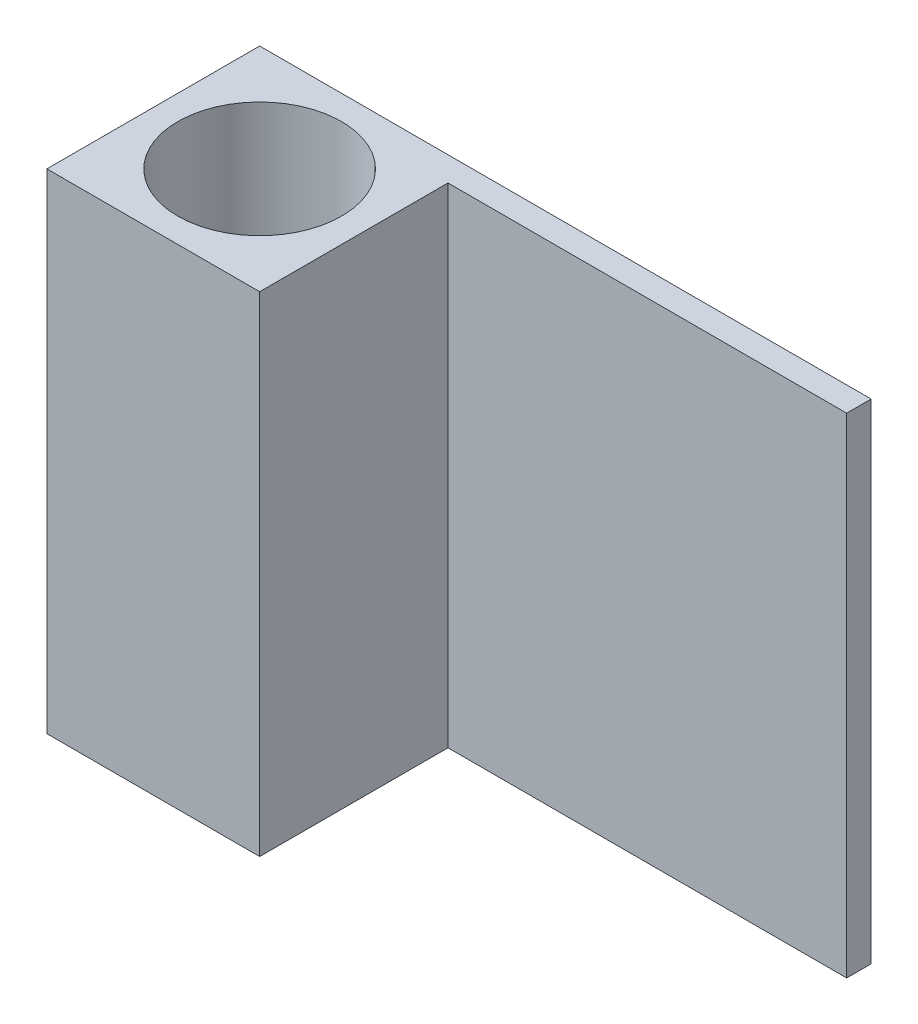
ISO-10303-21;
HEADER;
FILE_DESCRIPTION(('STEP AP214'),'2;1');
FILE_NAME('part.step','',(''),(''),'','','');
FILE_SCHEMA(('AUTOMOTIVE_DESIGN { 1 0 10303 214 1 1 1 1 }'));
ENDSEC;
DATA;
#1=APPLICATION_CONTEXT('core data for automotive mechanical design processes');
#2=APPLICATION_PROTOCOL_DEFINITION('international standard','automotive_design',2000,#1);
#3=PRODUCT_CONTEXT('',#1,'mechanical');
#4=PRODUCT('Part','Part','',(#3));
#5=PRODUCT_RELATED_PRODUCT_CATEGORY('part','',(#4));
#6=PRODUCT_DEFINITION_FORMATION('','',#4);
#7=PRODUCT_DEFINITION_CONTEXT('part definition',#1,'design');
#8=PRODUCT_DEFINITION('design','',#6,#7);
#9=PRODUCT_DEFINITION_SHAPE('','',#8);
#10=(LENGTH_UNIT() NAMED_UNIT(*) SI_UNIT(.MILLI.,.METRE.));
#11=(NAMED_UNIT(*) PLANE_ANGLE_UNIT() SI_UNIT($,.RADIAN.));
#12=(NAMED_UNIT(*) SI_UNIT($,.STERADIAN.) SOLID_ANGLE_UNIT());
#13=UNCERTAINTY_MEASURE_WITH_UNIT(LENGTH_MEASURE(1.E-05),#10,'distance_accuracy_value','');
#14=(GEOMETRIC_REPRESENTATION_CONTEXT(3) GLOBAL_UNCERTAINTY_ASSIGNED_CONTEXT((#13)) GLOBAL_UNIT_ASSIGNED_CONTEXT((#10,
#11,#12)) REPRESENTATION_CONTEXT('',''));
#15=CARTESIAN_POINT('',(0.,0.,0.));
#16=DIRECTION('',(0.,0.,1.));
#17=DIRECTION('',(1.,0.,0.));
#18=AXIS2_PLACEMENT_3D('',#15,#16,#17);
#19=CARTESIAN_POINT('',(82.6,80.,0.));
#20=DIRECTION('',(1.,0.,0.));
#21=DIRECTION('',(0.,0.,-1.));
#22=AXIS2_PLACEMENT_3D('',#19,#20,#21);
#23=PLANE('',#22);
#24=DIRECTION('',(0.,0.,1.));
#25=VECTOR('',#24,1.);
#26=CARTESIAN_POINT('',(82.6,0.,0.));
#27=LINE('',#26,#25);
#28=CARTESIAN_POINT('',(82.6,0.,-17.4));
#29=VERTEX_POINT('',#28);
#30=CARTESIAN_POINT('',(82.6,0.,-13.4));
#31=VERTEX_POINT('',#30);
#32=EDGE_CURVE('E120',#29,#31,#27,.T.);
#33=ORIENTED_EDGE('',*,*,#32,.F.);
#34=DIRECTION('',(0.,-1.,0.));
#35=VECTOR('',#34,1.);
#36=CARTESIAN_POINT('',(82.6,80.,-17.4));
#37=LINE('',#36,#35);
#38=CARTESIAN_POINT('',(82.6,80.,-17.4));
#39=VERTEX_POINT('',#38);
#40=EDGE_CURVE('E11',#39,#29,#37,.T.);
#41=ORIENTED_EDGE('',*,*,#40,.F.);
#42=DIRECTION('',(0.,0.,1.));
#43=VECTOR('',#42,1.);
#44=CARTESIAN_POINT('',(82.6,80.,0.));
#45=LINE('',#44,#43);
#46=CARTESIAN_POINT('',(82.6,80.,-13.4));
#47=VERTEX_POINT('',#46);
#48=EDGE_CURVE('E148',#39,#47,#45,.T.);
#49=ORIENTED_EDGE('',*,*,#48,.T.);
#50=DIRECTION('',(0.,-1.,0.));
#51=VECTOR('',#50,1.);
#52=CARTESIAN_POINT('',(82.6,80.,-13.4));
#53=LINE('',#52,#51);
#54=EDGE_CURVE('E80',#47,#31,#53,.T.);
#55=ORIENTED_EDGE('',*,*,#54,.T.);
#56=EDGE_LOOP('',(#33,#41,#49,#55));
#57=FACE_BOUND('',#56,.T.);
#58=ADVANCED_FACE('F35',(#57),#23,.T.);
#59=CARTESIAN_POINT('',(0.,80.,-17.4));
#60=DIRECTION('',(0.,0.,-1.));
#61=DIRECTION('',(-1.,0.,0.));
#62=AXIS2_PLACEMENT_3D('',#59,#60,#61);
#63=PLANE('',#62);
#64=DIRECTION('',(1.,0.,0.));
#65=VECTOR('',#64,1.);
#66=CARTESIAN_POINT('',(0.,0.,-17.4));
#67=LINE('',#66,#65);
#68=CARTESIAN_POINT('',(-17.4,0.,-17.4));
#69=VERTEX_POINT('',#68);
#70=EDGE_CURVE('E123',#69,#29,#67,.T.);
#71=ORIENTED_EDGE('',*,*,#70,.F.);
#72=DIRECTION('',(0.,-1.,0.));
#73=VECTOR('',#72,1.);
#74=CARTESIAN_POINT('',(-17.4,80.,-17.4));
#75=LINE('',#74,#73);
#76=CARTESIAN_POINT('',(-17.4,80.,-17.4));
#77=VERTEX_POINT('',#76);
#78=EDGE_CURVE('E44',#77,#69,#75,.T.);
#79=ORIENTED_EDGE('',*,*,#78,.F.);
#80=DIRECTION('',(1.,0.,0.));
#81=VECTOR('',#80,1.);
#82=CARTESIAN_POINT('',(0.,80.,-17.4));
#83=LINE('',#82,#81);
#84=EDGE_CURVE('E146',#77,#39,#83,.T.);
#85=ORIENTED_EDGE('',*,*,#84,.T.);
#86=ORIENTED_EDGE('',*,*,#40,.T.);
#87=EDGE_LOOP('',(#71,#79,#85,#86));
#88=FACE_BOUND('',#87,.T.);
#89=ADVANCED_FACE('F145',(#88),#63,.T.);
#90=CARTESIAN_POINT('',(-17.4,80.,0.));
#91=DIRECTION('',(1.,0.,0.));
#92=DIRECTION('',(0.,0.,-1.));
#93=AXIS2_PLACEMENT_3D('',#90,#91,#92);
#94=PLANE('',#93);
#95=DIRECTION('',(0.,0.,1.));
#96=VECTOR('',#95,1.);
#97=CARTESIAN_POINT('',(-17.4,0.,0.));
#98=LINE('',#97,#96);
#99=CARTESIAN_POINT('',(-17.4,0.,17.4));
#100=VERTEX_POINT('',#99);
#101=EDGE_CURVE('E126',#69,#100,#98,.T.);
#102=ORIENTED_EDGE('',*,*,#101,.T.);
#103=DIRECTION('',(0.,-1.,0.));
#104=VECTOR('',#103,1.);
#105=CARTESIAN_POINT('',(-17.4,80.,17.4));
#106=LINE('',#105,#104);
#107=CARTESIAN_POINT('',(-17.4,80.,17.4));
#108=VERTEX_POINT('',#107);
#109=EDGE_CURVE('E110',#108,#100,#106,.T.);
#110=ORIENTED_EDGE('',*,*,#109,.F.);
#111=DIRECTION('',(0.,0.,1.));
#112=VECTOR('',#111,1.);
#113=CARTESIAN_POINT('',(-17.4,80.,0.));
#114=LINE('',#113,#112);
#115=EDGE_CURVE('E98',#77,#108,#114,.T.);
#116=ORIENTED_EDGE('',*,*,#115,.F.);
#117=ORIENTED_EDGE('',*,*,#78,.T.);
#118=EDGE_LOOP('',(#102,#110,#116,#117));
#119=FACE_BOUND('',#118,.T.);
#120=ADVANCED_FACE('F139',(#119),#94,.F.);
#121=CARTESIAN_POINT('',(0.,80.,17.4));
#122=DIRECTION('',(0.,0.,-1.));
#123=DIRECTION('',(-1.,0.,0.));
#124=AXIS2_PLACEMENT_3D('',#121,#122,#123);
#125=PLANE('',#124);
#126=DIRECTION('',(1.,0.,0.));
#127=VECTOR('',#126,1.);
#128=CARTESIAN_POINT('',(0.,0.,17.4));
#129=LINE('',#128,#127);
#130=CARTESIAN_POINT('',(17.4,0.,17.4));
#131=VERTEX_POINT('',#130);
#132=EDGE_CURVE('E106',#100,#131,#129,.T.);
#133=ORIENTED_EDGE('',*,*,#132,.T.);
#134=DIRECTION('',(0.,-1.,0.));
#135=VECTOR('',#134,1.);
#136=CARTESIAN_POINT('',(17.4,80.,17.4));
#137=LINE('',#136,#135);
#138=CARTESIAN_POINT('',(17.4,80.,17.4));
#139=VERTEX_POINT('',#138);
#140=EDGE_CURVE('E104',#139,#131,#137,.T.);
#141=ORIENTED_EDGE('',*,*,#140,.F.);
#142=DIRECTION('',(1.,0.,0.));
#143=VECTOR('',#142,1.);
#144=CARTESIAN_POINT('',(0.,80.,17.4));
#145=LINE('',#144,#143);
#146=EDGE_CURVE('E91',#108,#139,#145,.T.);
#147=ORIENTED_EDGE('',*,*,#146,.F.);
#148=ORIENTED_EDGE('',*,*,#109,.T.);
#149=EDGE_LOOP('',(#133,#141,#147,#148));
#150=FACE_BOUND('',#149,.T.);
#151=ADVANCED_FACE('F105',(#150),#125,.F.);
#152=CARTESIAN_POINT('',(17.4,80.,0.));
#153=DIRECTION('',(1.,0.,0.));
#154=DIRECTION('',(0.,0.,-1.));
#155=AXIS2_PLACEMENT_3D('',#152,#153,#154);
#156=PLANE('',#155);
#157=DIRECTION('',(0.,0.,1.));
#158=VECTOR('',#157,1.);
#159=CARTESIAN_POINT('',(17.4,0.,0.));
#160=LINE('',#159,#158);
#161=CARTESIAN_POINT('',(17.4,0.,-13.4));
#162=VERTEX_POINT('',#161);
#163=EDGE_CURVE('E130',#162,#131,#160,.T.);
#164=ORIENTED_EDGE('',*,*,#163,.F.);
#165=DIRECTION('',(0.,-1.,0.));
#166=VECTOR('',#165,1.);
#167=CARTESIAN_POINT('',(17.4,80.,-13.4));
#168=LINE('',#167,#166);
#169=CARTESIAN_POINT('',(17.4,80.,-13.4));
#170=VERTEX_POINT('',#169);
#171=EDGE_CURVE('E73',#170,#162,#168,.T.);
#172=ORIENTED_EDGE('',*,*,#171,.F.);
#173=DIRECTION('',(0.,0.,1.));
#174=VECTOR('',#173,1.);
#175=CARTESIAN_POINT('',(17.4,80.,0.));
#176=LINE('',#175,#174);
#177=EDGE_CURVE('E95',#170,#139,#176,.T.);
#178=ORIENTED_EDGE('',*,*,#177,.T.);
#179=ORIENTED_EDGE('',*,*,#140,.T.);
#180=EDGE_LOOP('',(#164,#172,#178,#179));
#181=FACE_BOUND('',#180,.T.);
#182=ADVANCED_FACE('F112',(#181),#156,.T.);
#183=CARTESIAN_POINT('',(0.,80.,0.));
#184=DIRECTION('',(0.,-1.,0.));
#185=DIRECTION('',(0.,0.,-1.));
#186=AXIS2_PLACEMENT_3D('',#183,#184,#185);
#187=CYLINDRICAL_SURFACE('',#186,13.4);
#188=CARTESIAN_POINT('',(0.,80.,0.));
#189=DIRECTION('',(0.,1.,0.));
#190=DIRECTION('',(0.,0.,1.));
#191=AXIS2_PLACEMENT_3D('',#188,#189,#190);
#192=CIRCLE('',#191,13.4);
#193=CARTESIAN_POINT('',(0.,80.,13.4));
#194=VERTEX_POINT('',#193);
#195=EDGE_CURVE('E134',#194,#194,#192,.T.);
#196=ORIENTED_EDGE('',*,*,#195,.T.);
#197=EDGE_LOOP('',(#196));
#198=FACE_BOUND('',#197,.T.);
#199=CARTESIAN_POINT('',(0.,0.,0.));
#200=DIRECTION('',(0.,1.,0.));
#201=DIRECTION('',(0.,0.,1.));
#202=AXIS2_PLACEMENT_3D('',#199,#200,#201);
#203=CIRCLE('',#202,13.4);
#204=CARTESIAN_POINT('',(0.,0.,13.4));
#205=VERTEX_POINT('',#204);
#206=EDGE_CURVE('E117',#205,#205,#203,.T.);
#207=ORIENTED_EDGE('',*,*,#206,.F.);
#208=EDGE_LOOP('',(#207));
#209=FACE_BOUND('',#208,.T.);
#210=ADVANCED_FACE('F37',(#198,#209),#187,.F.);
#211=CARTESIAN_POINT('',(0.,80.,-13.4));
#212=DIRECTION('',(0.,0.,-1.));
#213=DIRECTION('',(-1.,0.,0.));
#214=AXIS2_PLACEMENT_3D('',#211,#212,#213);
#215=PLANE('',#214);
#216=DIRECTION('',(1.,0.,0.));
#217=VECTOR('',#216,1.);
#218=CARTESIAN_POINT('',(0.,0.,-13.4));
#219=LINE('',#218,#217);
#220=EDGE_CURVE('E132',#162,#31,#219,.T.);
#221=ORIENTED_EDGE('',*,*,#220,.T.);
#222=ORIENTED_EDGE('',*,*,#54,.F.);
#223=DIRECTION('',(1.,0.,0.));
#224=VECTOR('',#223,1.);
#225=CARTESIAN_POINT('',(0.,80.,-13.4));
#226=LINE('',#225,#224);
#227=EDGE_CURVE('E52',#170,#47,#226,.T.);
#228=ORIENTED_EDGE('',*,*,#227,.F.);
#229=ORIENTED_EDGE('',*,*,#171,.T.);
#230=EDGE_LOOP('',(#221,#222,#228,#229));
#231=FACE_BOUND('',#230,.T.);
#232=ADVANCED_FACE('F147',(#231),#215,.F.);
#233=CARTESIAN_POINT('',(0.,80.,0.));
#234=DIRECTION('',(0.,1.,0.));
#235=DIRECTION('',(0.,0.,1.));
#236=AXIS2_PLACEMENT_3D('',#233,#234,#235);
#237=PLANE('',#236);
#238=ORIENTED_EDGE('',*,*,#195,.F.);
#239=EDGE_LOOP('',(#238));
#240=FACE_BOUND('',#239,.T.);
#241=ORIENTED_EDGE('',*,*,#48,.F.);
#242=ORIENTED_EDGE('',*,*,#84,.F.);
#243=ORIENTED_EDGE('',*,*,#115,.T.);
#244=ORIENTED_EDGE('',*,*,#146,.T.);
#245=ORIENTED_EDGE('',*,*,#177,.F.);
#246=ORIENTED_EDGE('',*,*,#227,.T.);
#247=EDGE_LOOP('',(#241,#242,#243,#244,#245,#246));
#248=FACE_BOUND('',#247,.T.);
#249=ADVANCED_FACE('F93',(#240,#248),#237,.T.);
#250=CARTESIAN_POINT('',(0.,0.,0.));
#251=DIRECTION('',(0.,1.,0.));
#252=DIRECTION('',(0.,0.,1.));
#253=AXIS2_PLACEMENT_3D('',#250,#251,#252);
#254=PLANE('',#253);
#255=ORIENTED_EDGE('',*,*,#206,.T.);
#256=EDGE_LOOP('',(#255));
#257=FACE_BOUND('',#256,.T.);
#258=ORIENTED_EDGE('',*,*,#32,.T.);
#259=ORIENTED_EDGE('',*,*,#220,.F.);
#260=ORIENTED_EDGE('',*,*,#163,.T.);
#261=ORIENTED_EDGE('',*,*,#132,.F.);
#262=ORIENTED_EDGE('',*,*,#101,.F.);
#263=ORIENTED_EDGE('',*,*,#70,.T.);
#264=EDGE_LOOP('',(#258,#259,#260,#261,#262,#263));
#265=FACE_BOUND('',#264,.T.);
#266=ADVANCED_FACE('F144',(#257,#265),#254,.F.);
#267=CLOSED_SHELL('',(#58,#89,#120,#151,#182,#210,#232,#249,#266));
#268=MANIFOLD_SOLID_BREP('B2',#267);
#269=ADVANCED_BREP_SHAPE_REPRESENTATION('',(#18,#268),#14);
#270=SHAPE_DEFINITION_REPRESENTATION(#9,#269);
ENDSEC;
END-ISO-10303-21;
